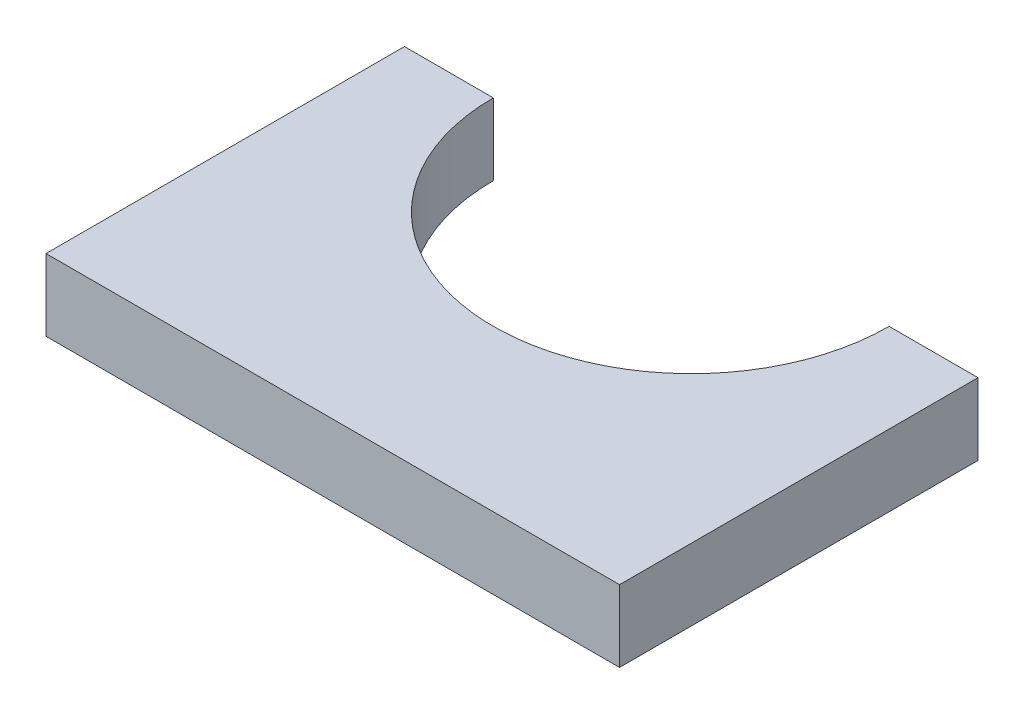
ISO-10303-21;
HEADER;
FILE_DESCRIPTION(('STEP AP214'),'2;1');
FILE_NAME('part.step','',(''),(''),'','','');
FILE_SCHEMA(('AUTOMOTIVE_DESIGN { 1 0 10303 214 1 1 1 1 }'));
ENDSEC;
DATA;
#1=APPLICATION_CONTEXT('core data for automotive mechanical design processes');
#2=APPLICATION_PROTOCOL_DEFINITION('international standard','automotive_design',2000,#1);
#3=PRODUCT_CONTEXT('',#1,'mechanical');
#4=PRODUCT('Part','Part','',(#3));
#5=PRODUCT_RELATED_PRODUCT_CATEGORY('part','',(#4));
#6=PRODUCT_DEFINITION_FORMATION('','',#4);
#7=PRODUCT_DEFINITION_CONTEXT('part definition',#1,'design');
#8=PRODUCT_DEFINITION('design','',#6,#7);
#9=PRODUCT_DEFINITION_SHAPE('','',#8);
#10=(LENGTH_UNIT() NAMED_UNIT(*) SI_UNIT(.MILLI.,.METRE.));
#11=(NAMED_UNIT(*) PLANE_ANGLE_UNIT() SI_UNIT($,.RADIAN.));
#12=(NAMED_UNIT(*) SI_UNIT($,.STERADIAN.) SOLID_ANGLE_UNIT());
#13=UNCERTAINTY_MEASURE_WITH_UNIT(LENGTH_MEASURE(1.E-05),#10,'distance_accuracy_value','');
#14=(GEOMETRIC_REPRESENTATION_CONTEXT(3) GLOBAL_UNCERTAINTY_ASSIGNED_CONTEXT((#13)) GLOBAL_UNIT_ASSIGNED_CONTEXT((#10,
#11,#12)) REPRESENTATION_CONTEXT('',''));
#15=CARTESIAN_POINT('',(0.,0.,0.));
#16=DIRECTION('',(0.,0.,1.));
#17=DIRECTION('',(1.,0.,0.));
#18=AXIS2_PLACEMENT_3D('',#15,#16,#17);
#19=CARTESIAN_POINT('',(-25.4,6.35,-15.875));
#20=DIRECTION('',(0.,0.,1.));
#21=DIRECTION('',(1.,0.,0.));
#22=AXIS2_PLACEMENT_3D('',#19,#20,#21);
#23=PLANE('',#22);
#24=DIRECTION('',(-1.,0.,0.));
#25=VECTOR('',#24,1.);
#26=CARTESIAN_POINT('',(-25.4,0.,-15.875));
#27=LINE('',#26,#25);
#28=CARTESIAN_POINT('',(25.4,0.,-15.875));
#29=VERTEX_POINT('',#28);
#30=CARTESIAN_POINT('',(17.526,0.,-15.875));
#31=VERTEX_POINT('',#30);
#32=EDGE_CURVE('E118',#29,#31,#27,.T.);
#33=ORIENTED_EDGE('',*,*,#32,.T.);
#34=DIRECTION('',(0.,1.,0.));
#35=VECTOR('',#34,1.);
#36=CARTESIAN_POINT('',(17.526,0.,-15.875));
#37=LINE('',#36,#35);
#38=CARTESIAN_POINT('',(17.526,6.35,-15.875));
#39=VERTEX_POINT('',#38);
#40=EDGE_CURVE('E52',#31,#39,#37,.T.);
#41=ORIENTED_EDGE('',*,*,#40,.T.);
#42=DIRECTION('',(-1.,0.,0.));
#43=VECTOR('',#42,1.);
#44=CARTESIAN_POINT('',(-25.4,6.35,-15.875));
#45=LINE('',#44,#43);
#46=CARTESIAN_POINT('',(25.4,6.35,-15.875));
#47=VERTEX_POINT('',#46);
#48=EDGE_CURVE('E88',#47,#39,#45,.T.);
#49=ORIENTED_EDGE('',*,*,#48,.F.);
#50=DIRECTION('',(0.,-1.,0.));
#51=VECTOR('',#50,1.);
#52=CARTESIAN_POINT('',(25.4,6.35,-15.875));
#53=LINE('',#52,#51);
#54=EDGE_CURVE('E11',#47,#29,#53,.T.);
#55=ORIENTED_EDGE('',*,*,#54,.T.);
#56=EDGE_LOOP('',(#33,#41,#49,#55));
#57=FACE_BOUND('',#56,.T.);
#58=ADVANCED_FACE('F37',(#57),#23,.F.);
#59=CARTESIAN_POINT('',(25.4,6.35,15.875));
#60=DIRECTION('',(-1.,0.,0.));
#61=DIRECTION('',(0.,0.,1.));
#62=AXIS2_PLACEMENT_3D('',#59,#60,#61);
#63=PLANE('',#62);
#64=DIRECTION('',(0.,0.,-1.));
#65=VECTOR('',#64,1.);
#66=CARTESIAN_POINT('',(25.4,0.,15.875));
#67=LINE('',#66,#65);
#68=CARTESIAN_POINT('',(25.4,0.,15.875));
#69=VERTEX_POINT('',#68);
#70=EDGE_CURVE('E113',#69,#29,#67,.T.);
#71=ORIENTED_EDGE('',*,*,#70,.T.);
#72=ORIENTED_EDGE('',*,*,#54,.F.);
#73=DIRECTION('',(0.,0.,-1.));
#74=VECTOR('',#73,1.);
#75=CARTESIAN_POINT('',(25.4,6.35,15.875));
#76=LINE('',#75,#74);
#77=CARTESIAN_POINT('',(25.4,6.35,15.875));
#78=VERTEX_POINT('',#77);
#79=EDGE_CURVE('E126',#78,#47,#76,.T.);
#80=ORIENTED_EDGE('',*,*,#79,.F.);
#81=DIRECTION('',(0.,-1.,0.));
#82=VECTOR('',#81,1.);
#83=CARTESIAN_POINT('',(25.4,6.35,15.875));
#84=LINE('',#83,#82);
#85=EDGE_CURVE('E127',#78,#69,#84,.T.);
#86=ORIENTED_EDGE('',*,*,#85,.T.);
#87=EDGE_LOOP('',(#71,#72,#80,#86));
#88=FACE_BOUND('',#87,.T.);
#89=ADVANCED_FACE('F39',(#88),#63,.F.);
#90=CARTESIAN_POINT('',(-17.526,6.35,-15.875));
#91=VERTEX_POINT('',#90);
#92=CARTESIAN_POINT('',(-25.4,6.35,-15.875));
#93=VERTEX_POINT('',#92);
#94=EDGE_CURVE('E112',#91,#93,#45,.T.);
#95=ORIENTED_EDGE('',*,*,#94,.F.);
#96=DIRECTION('',(0.,1.,0.));
#97=VECTOR('',#96,1.);
#98=CARTESIAN_POINT('',(-17.526,0.,-15.875));
#99=LINE('',#98,#97);
#100=CARTESIAN_POINT('',(-17.526,0.,-15.875));
#101=VERTEX_POINT('',#100);
#102=EDGE_CURVE('E99',#101,#91,#99,.T.);
#103=ORIENTED_EDGE('',*,*,#102,.F.);
#104=CARTESIAN_POINT('',(-25.4,0.,-15.875));
#105=VERTEX_POINT('',#104);
#106=EDGE_CURVE('E110',#101,#105,#27,.T.);
#107=ORIENTED_EDGE('',*,*,#106,.T.);
#108=DIRECTION('',(0.,-1.,0.));
#109=VECTOR('',#108,1.);
#110=CARTESIAN_POINT('',(-25.4,6.35,-15.875));
#111=LINE('',#110,#109);
#112=EDGE_CURVE('E45',#93,#105,#111,.T.);
#113=ORIENTED_EDGE('',*,*,#112,.F.);
#114=EDGE_LOOP('',(#95,#103,#107,#113));
#115=FACE_BOUND('',#114,.T.);
#116=ADVANCED_FACE('F108',(#115),#23,.F.);
#117=CARTESIAN_POINT('',(-25.4,6.35,15.875));
#118=DIRECTION('',(1.,0.,0.));
#119=DIRECTION('',(0.,0.,-1.));
#120=AXIS2_PLACEMENT_3D('',#117,#118,#119);
#121=PLANE('',#120);
#122=DIRECTION('',(0.,0.,1.));
#123=VECTOR('',#122,1.);
#124=CARTESIAN_POINT('',(-25.4,0.,15.875));
#125=LINE('',#124,#123);
#126=CARTESIAN_POINT('',(-25.4,0.,15.875));
#127=VERTEX_POINT('',#126);
#128=EDGE_CURVE('E117',#105,#127,#125,.T.);
#129=ORIENTED_EDGE('',*,*,#128,.T.);
#130=DIRECTION('',(0.,-1.,0.));
#131=VECTOR('',#130,1.);
#132=CARTESIAN_POINT('',(-25.4,6.35,15.875));
#133=LINE('',#132,#131);
#134=CARTESIAN_POINT('',(-25.4,6.35,15.875));
#135=VERTEX_POINT('',#134);
#136=EDGE_CURVE('E129',#135,#127,#133,.T.);
#137=ORIENTED_EDGE('',*,*,#136,.F.);
#138=DIRECTION('',(0.,0.,1.));
#139=VECTOR('',#138,1.);
#140=CARTESIAN_POINT('',(-25.4,6.35,15.875));
#141=LINE('',#140,#139);
#142=EDGE_CURVE('E134',#93,#135,#141,.T.);
#143=ORIENTED_EDGE('',*,*,#142,.F.);
#144=ORIENTED_EDGE('',*,*,#112,.T.);
#145=EDGE_LOOP('',(#129,#137,#143,#144));
#146=FACE_BOUND('',#145,.T.);
#147=ADVANCED_FACE('F132',(#146),#121,.F.);
#148=CARTESIAN_POINT('',(-25.4,6.35,15.875));
#149=DIRECTION('',(0.,0.,-1.));
#150=DIRECTION('',(-1.,0.,0.));
#151=AXIS2_PLACEMENT_3D('',#148,#149,#150);
#152=PLANE('',#151);
#153=DIRECTION('',(1.,0.,0.));
#154=VECTOR('',#153,1.);
#155=CARTESIAN_POINT('',(-25.4,0.,15.875));
#156=LINE('',#155,#154);
#157=EDGE_CURVE('E82',#127,#69,#156,.T.);
#158=ORIENTED_EDGE('',*,*,#157,.T.);
#159=ORIENTED_EDGE('',*,*,#85,.F.);
#160=DIRECTION('',(1.,0.,0.));
#161=VECTOR('',#160,1.);
#162=CARTESIAN_POINT('',(-25.4,6.35,15.875));
#163=LINE('',#162,#161);
#164=EDGE_CURVE('E61',#135,#78,#163,.T.);
#165=ORIENTED_EDGE('',*,*,#164,.F.);
#166=ORIENTED_EDGE('',*,*,#136,.T.);
#167=EDGE_LOOP('',(#158,#159,#165,#166));
#168=FACE_BOUND('',#167,.T.);
#169=ADVANCED_FACE('F145',(#168),#152,.F.);
#170=CARTESIAN_POINT('',(0.,6.35,0.));
#171=DIRECTION('',(0.,-1.,0.));
#172=DIRECTION('',(0.,0.,-1.));
#173=AXIS2_PLACEMENT_3D('',#170,#171,#172);
#174=PLANE('',#173);
#175=ORIENTED_EDGE('',*,*,#48,.T.);
#176=CARTESIAN_POINT('',(0.,6.35,-15.875));
#177=DIRECTION('',(0.,1.,0.));
#178=DIRECTION('',(0.,0.,-1.));
#179=AXIS2_PLACEMENT_3D('',#176,#177,#178);
#180=CIRCLE('',#179,17.526);
#181=EDGE_CURVE('E104',#91,#39,#180,.T.);
#182=ORIENTED_EDGE('',*,*,#181,.F.);
#183=ORIENTED_EDGE('',*,*,#94,.T.);
#184=ORIENTED_EDGE('',*,*,#142,.T.);
#185=ORIENTED_EDGE('',*,*,#164,.T.);
#186=ORIENTED_EDGE('',*,*,#79,.T.);
#187=EDGE_LOOP('',(#175,#182,#183,#184,#185,#186));
#188=FACE_BOUND('',#187,.T.);
#189=ADVANCED_FACE('F140',(#188),#174,.F.);
#190=CARTESIAN_POINT('',(0.,0.,0.));
#191=DIRECTION('',(0.,-1.,0.));
#192=DIRECTION('',(0.,0.,-1.));
#193=AXIS2_PLACEMENT_3D('',#190,#191,#192);
#194=PLANE('',#193);
#195=CARTESIAN_POINT('',(0.,0.,-15.875));
#196=DIRECTION('',(0.,1.,0.));
#197=DIRECTION('',(0.,0.,-1.));
#198=AXIS2_PLACEMENT_3D('',#195,#196,#197);
#199=CIRCLE('',#198,17.526);
#200=EDGE_CURVE('E96',#101,#31,#199,.T.);
#201=ORIENTED_EDGE('',*,*,#200,.T.);
#202=ORIENTED_EDGE('',*,*,#32,.F.);
#203=ORIENTED_EDGE('',*,*,#70,.F.);
#204=ORIENTED_EDGE('',*,*,#157,.F.);
#205=ORIENTED_EDGE('',*,*,#128,.F.);
#206=ORIENTED_EDGE('',*,*,#106,.F.);
#207=EDGE_LOOP('',(#201,#202,#203,#204,#205,#206));
#208=FACE_BOUND('',#207,.T.);
#209=ADVANCED_FACE('F116',(#208),#194,.T.);
#210=CARTESIAN_POINT('',(0.,0.,-15.875));
#211=DIRECTION('',(0.,1.,0.));
#212=DIRECTION('',(0.,0.,1.));
#213=AXIS2_PLACEMENT_3D('',#210,#211,#212);
#214=CYLINDRICAL_SURFACE('',#213,17.526);
#215=ORIENTED_EDGE('',*,*,#181,.T.);
#216=ORIENTED_EDGE('',*,*,#40,.F.);
#217=ORIENTED_EDGE('',*,*,#200,.F.);
#218=ORIENTED_EDGE('',*,*,#102,.T.);
#219=EDGE_LOOP('',(#215,#216,#217,#218));
#220=FACE_BOUND('',#219,.T.);
#221=ADVANCED_FACE('F98',(#220),#214,.F.);
#222=CLOSED_SHELL('',(#58,#89,#116,#147,#169,#189,#209,#221));
#223=MANIFOLD_SOLID_BREP('B2',#222);
#224=ADVANCED_BREP_SHAPE_REPRESENTATION('',(#18,#223),#14);
#225=SHAPE_DEFINITION_REPRESENTATION(#9,#224);
ENDSEC;
END-ISO-10303-21;
